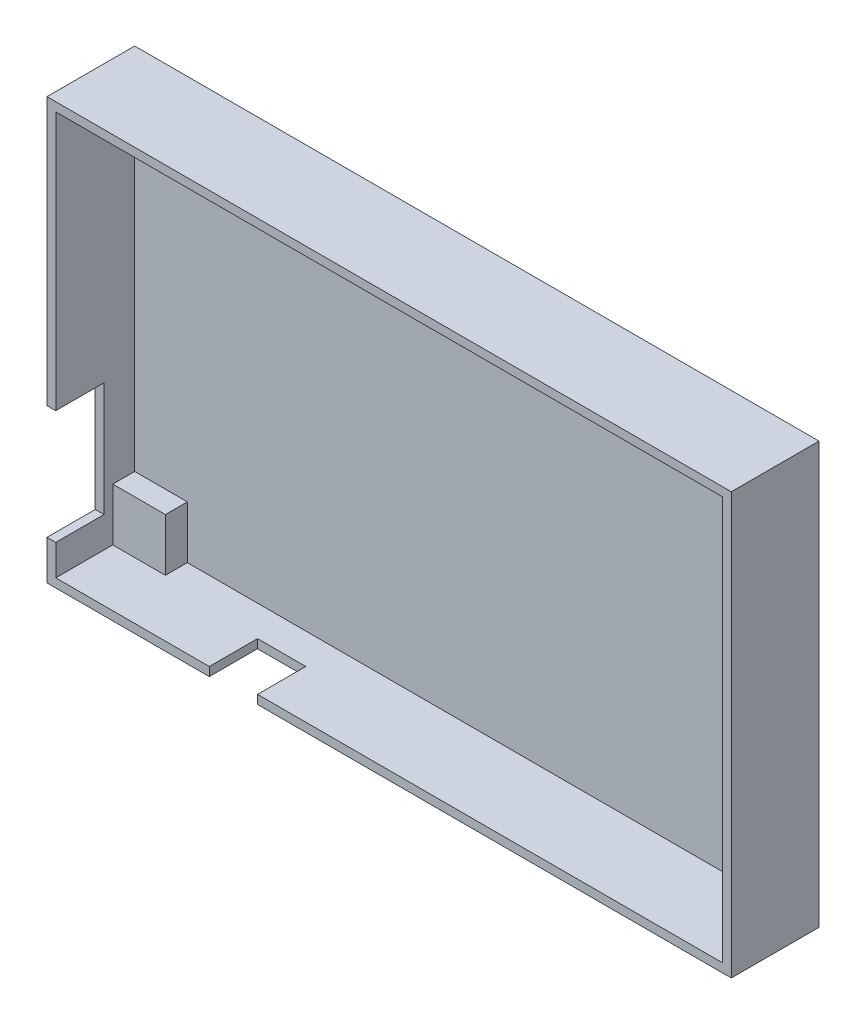
ISO-10303-21;
HEADER;
FILE_DESCRIPTION(('STEP AP214'),'2;1');
FILE_NAME('part.step','',(''),(''),'','','');
FILE_SCHEMA(('AUTOMOTIVE_DESIGN { 1 0 10303 214 1 1 1 1 }'));
ENDSEC;
DATA;
#1=APPLICATION_CONTEXT('core data for automotive mechanical design processes');
#2=APPLICATION_PROTOCOL_DEFINITION('international standard','automotive_design',2000,#1);
#3=PRODUCT_CONTEXT('',#1,'mechanical');
#4=PRODUCT('Part','Part','',(#3));
#5=PRODUCT_RELATED_PRODUCT_CATEGORY('part','',(#4));
#6=PRODUCT_DEFINITION_FORMATION('','',#4);
#7=PRODUCT_DEFINITION_CONTEXT('part definition',#1,'design');
#8=PRODUCT_DEFINITION('design','',#6,#7);
#9=PRODUCT_DEFINITION_SHAPE('','',#8);
#10=(LENGTH_UNIT() NAMED_UNIT(*) SI_UNIT(.MILLI.,.METRE.));
#11=(NAMED_UNIT(*) PLANE_ANGLE_UNIT() SI_UNIT($,.RADIAN.));
#12=(NAMED_UNIT(*) SI_UNIT($,.STERADIAN.) SOLID_ANGLE_UNIT());
#13=UNCERTAINTY_MEASURE_WITH_UNIT(LENGTH_MEASURE(1.E-05),#10,'distance_accuracy_value','');
#14=(GEOMETRIC_REPRESENTATION_CONTEXT(3) GLOBAL_UNCERTAINTY_ASSIGNED_CONTEXT((#13)) GLOBAL_UNIT_ASSIGNED_CONTEXT((#10,
#11,#12)) REPRESENTATION_CONTEXT('',''));
#15=CARTESIAN_POINT('',(0.,0.,0.));
#16=DIRECTION('',(0.,0.,1.));
#17=DIRECTION('',(1.,0.,0.));
#18=AXIS2_PLACEMENT_3D('',#15,#16,#17);
#19=CARTESIAN_POINT('',(0.,0.,20.));
#20=DIRECTION('',(0.,0.,1.));
#21=DIRECTION('',(1.,0.,0.));
#22=AXIS2_PLACEMENT_3D('',#19,#20,#21);
#23=PLANE('',#22);
#24=DIRECTION('',(1.,0.,0.));
#25=VECTOR('',#24,1.);
#26=CARTESIAN_POINT('',(-70.1385934908362,-49.4442392909897,20.));
#27=LINE('',#26,#25);
#28=CARTESIAN_POINT('',(-70.1385934908362,-49.4442392909897,20.));
#29=VERTEX_POINT('',#28);
#30=CARTESIAN_POINT('',(-33.1385934908362,-49.4442392909897,20.));
#31=VERTEX_POINT('',#30);
#32=EDGE_CURVE('E387',#29,#31,#27,.T.);
#33=ORIENTED_EDGE('',*,*,#32,.T.);
#34=DIRECTION('',(0.,-1.,0.));
#35=VECTOR('',#34,1.);
#36=CARTESIAN_POINT('',(-33.1385934908362,-43.6716541193631,20.));
#37=LINE('',#36,#35);
#38=CARTESIAN_POINT('',(-33.1385934908362,-47.4442392909897,20.));
#39=VERTEX_POINT('',#38);
#40=EDGE_CURVE('E437',#39,#31,#37,.T.);
#41=ORIENTED_EDGE('',*,*,#40,.F.);
#42=DIRECTION('',(1.,0.,0.));
#43=VECTOR('',#42,1.);
#44=CARTESIAN_POINT('',(-68.1385934908362,-47.4442392909897,20.));
#45=LINE('',#44,#43);
#46=CARTESIAN_POINT('',(-68.1385934908362,-47.4442392909897,20.));
#47=VERTEX_POINT('',#46);
#48=EDGE_CURVE('E240',#47,#39,#45,.T.);
#49=ORIENTED_EDGE('',*,*,#48,.F.);
#50=DIRECTION('',(0.,-1.,0.));
#51=VECTOR('',#50,1.);
#52=CARTESIAN_POINT('',(-68.1385934908362,44.5557607090103,20.));
#53=LINE('',#52,#51);
#54=CARTESIAN_POINT('',(-68.1385934908362,-40.4442392909897,20.));
#55=VERTEX_POINT('',#54);
#56=EDGE_CURVE('E354',#55,#47,#53,.T.);
#57=ORIENTED_EDGE('',*,*,#56,.F.);
#58=DIRECTION('',(-1.,0.,0.));
#59=VECTOR('',#58,1.);
#60=CARTESIAN_POINT('',(0.,-40.4442392909897,20.));
#61=LINE('',#60,#59);
#62=CARTESIAN_POINT('',(-70.1385934908362,-40.4442392909897,20.));
#63=VERTEX_POINT('',#62);
#64=EDGE_CURVE('E419',#55,#63,#61,.T.);
#65=ORIENTED_EDGE('',*,*,#64,.T.);
#66=DIRECTION('',(0.,-1.,0.));
#67=VECTOR('',#66,1.);
#68=CARTESIAN_POINT('',(-70.1385934908362,46.5557607090103,20.));
#69=LINE('',#68,#67);
#70=EDGE_CURVE('E382',#63,#29,#69,.T.);
#71=ORIENTED_EDGE('',*,*,#70,.T.);
#72=EDGE_LOOP('',(#33,#41,#49,#57,#65,#71));
#73=FACE_BOUND('',#72,.T.);
#74=ADVANCED_FACE('F35',(#73),#23,.T.);
#75=CARTESIAN_POINT('',(-22.1385934908362,-47.4442392909897,20.));
#76=VERTEX_POINT('',#75);
#77=CARTESIAN_POINT('',(83.8614065091638,-47.4442392909897,20.));
#78=VERTEX_POINT('',#77);
#79=EDGE_CURVE('E353',#76,#78,#45,.T.);
#80=ORIENTED_EDGE('',*,*,#79,.F.);
#81=DIRECTION('',(0.,1.,0.));
#82=VECTOR('',#81,1.);
#83=CARTESIAN_POINT('',(-22.1385934908362,-43.6716541193631,20.));
#84=LINE('',#83,#82);
#85=CARTESIAN_POINT('',(-22.1385934908362,-49.4442392909897,20.));
#86=VERTEX_POINT('',#85);
#87=EDGE_CURVE('E227',#86,#76,#84,.T.);
#88=ORIENTED_EDGE('',*,*,#87,.F.);
#89=CARTESIAN_POINT('',(85.8614065091638,-49.4442392909897,20.));
#90=VERTEX_POINT('',#89);
#91=EDGE_CURVE('E386',#86,#90,#27,.T.);
#92=ORIENTED_EDGE('',*,*,#91,.T.);
#93=DIRECTION('',(0.,1.,0.));
#94=VECTOR('',#93,1.);
#95=CARTESIAN_POINT('',(85.8614065091638,46.5557607090103,20.));
#96=LINE('',#95,#94);
#97=CARTESIAN_POINT('',(85.8614065091638,46.5557607090103,20.));
#98=VERTEX_POINT('',#97);
#99=EDGE_CURVE('E390',#90,#98,#96,.T.);
#100=ORIENTED_EDGE('',*,*,#99,.T.);
#101=DIRECTION('',(-1.,0.,0.));
#102=VECTOR('',#101,1.);
#103=CARTESIAN_POINT('',(-70.1385934908362,46.5557607090103,20.));
#104=LINE('',#103,#102);
#105=CARTESIAN_POINT('',(-70.1385934908362,46.5557607090103,20.));
#106=VERTEX_POINT('',#105);
#107=EDGE_CURVE('E393',#98,#106,#104,.T.);
#108=ORIENTED_EDGE('',*,*,#107,.T.);
#109=CARTESIAN_POINT('',(-70.1385934908362,-14.4442392909897,20.));
#110=VERTEX_POINT('',#109);
#111=EDGE_CURVE('E383',#106,#110,#69,.T.);
#112=ORIENTED_EDGE('',*,*,#111,.T.);
#113=DIRECTION('',(1.,0.,0.));
#114=VECTOR('',#113,1.);
#115=CARTESIAN_POINT('',(0.,-14.4442392909897,20.));
#116=LINE('',#115,#114);
#117=CARTESIAN_POINT('',(-68.1385934908362,-14.4442392909897,20.));
#118=VERTEX_POINT('',#117);
#119=EDGE_CURVE('E417',#110,#118,#116,.T.);
#120=ORIENTED_EDGE('',*,*,#119,.T.);
#121=CARTESIAN_POINT('',(-68.1385934908362,44.5557607090103,20.));
#122=VERTEX_POINT('',#121);
#123=EDGE_CURVE('E350',#122,#118,#53,.T.);
#124=ORIENTED_EDGE('',*,*,#123,.F.);
#125=DIRECTION('',(-1.,0.,0.));
#126=VECTOR('',#125,1.);
#127=CARTESIAN_POINT('',(-68.1385934908362,44.5557607090103,20.));
#128=LINE('',#127,#126);
#129=CARTESIAN_POINT('',(83.8614065091639,44.5557607090103,20.));
#130=VERTEX_POINT('',#129);
#131=EDGE_CURVE('E359',#130,#122,#128,.T.);
#132=ORIENTED_EDGE('',*,*,#131,.F.);
#133=DIRECTION('',(0.,1.,0.));
#134=VECTOR('',#133,1.);
#135=CARTESIAN_POINT('',(83.8614065091639,44.5557607090103,20.));
#136=LINE('',#135,#134);
#137=EDGE_CURVE('E356',#78,#130,#136,.T.);
#138=ORIENTED_EDGE('',*,*,#137,.F.);
#139=EDGE_LOOP('',(#80,#88,#92,#100,#108,#112,#120,#124,#132,#138));
#140=FACE_BOUND('',#139,.T.);
#141=ADVANCED_FACE('F434',(#140),#23,.T.);
#142=CARTESIAN_POINT('',(-68.1385934908362,-47.4442392909897,20.));
#143=DIRECTION('',(0.,1.,0.));
#144=DIRECTION('',(0.,0.,1.));
#145=AXIS2_PLACEMENT_3D('',#142,#143,#144);
#146=PLANE('',#145);
#147=ORIENTED_EDGE('',*,*,#48,.T.);
#148=DIRECTION('',(0.,0.,-1.));
#149=VECTOR('',#148,1.);
#150=CARTESIAN_POINT('',(-33.1385934908362,-47.4442392909897,20.));
#151=LINE('',#150,#149);
#152=CARTESIAN_POINT('',(-33.1385934908362,-47.4442392909897,9.));
#153=VERTEX_POINT('',#152);
#154=EDGE_CURVE('E231',#39,#153,#151,.T.);
#155=ORIENTED_EDGE('',*,*,#154,.T.);
#156=DIRECTION('',(1.,0.,0.));
#157=VECTOR('',#156,1.);
#158=CARTESIAN_POINT('',(-68.1385934908362,-47.4442392909897,9.));
#159=LINE('',#158,#157);
#160=CARTESIAN_POINT('',(-22.1385934908362,-47.4442392909897,9.));
#161=VERTEX_POINT('',#160);
#162=EDGE_CURVE('E219',#153,#161,#159,.T.);
#163=ORIENTED_EDGE('',*,*,#162,.T.);
#164=DIRECTION('',(0.,0.,1.));
#165=VECTOR('',#164,1.);
#166=CARTESIAN_POINT('',(-22.1385934908362,-47.4442392909897,20.));
#167=LINE('',#166,#165);
#168=EDGE_CURVE('E226',#161,#76,#167,.T.);
#169=ORIENTED_EDGE('',*,*,#168,.T.);
#170=ORIENTED_EDGE('',*,*,#79,.T.);
#171=DIRECTION('',(0.,0.,-1.));
#172=VECTOR('',#171,1.);
#173=CARTESIAN_POINT('',(83.8614065091638,-47.4442392909897,20.));
#174=LINE('',#173,#172);
#175=CARTESIAN_POINT('',(83.8614065091638,-47.4442392909897,7.));
#176=VERTEX_POINT('',#175);
#177=EDGE_CURVE('E376',#78,#176,#174,.T.);
#178=ORIENTED_EDGE('',*,*,#177,.T.);
#179=DIRECTION('',(1.,0.,0.));
#180=VECTOR('',#179,1.);
#181=CARTESIAN_POINT('',(83.8614065091638,-47.4442392909897,7.));
#182=LINE('',#181,#180);
#183=CARTESIAN_POINT('',(71.8614065091639,-47.4442392909897,7.));
#184=VERTEX_POINT('',#183);
#185=EDGE_CURVE('E311',#184,#176,#182,.T.);
#186=ORIENTED_EDGE('',*,*,#185,.F.);
#187=DIRECTION('',(0.,0.,-1.));
#188=VECTOR('',#187,1.);
#189=CARTESIAN_POINT('',(71.8614065091639,-47.4442392909897,7.));
#190=LINE('',#189,#188);
#191=CARTESIAN_POINT('',(71.8614065091639,-47.4442392909897,2.));
#192=VERTEX_POINT('',#191);
#193=EDGE_CURVE('E314',#184,#192,#190,.T.);
#194=ORIENTED_EDGE('',*,*,#193,.T.);
#195=DIRECTION('',(1.,0.,0.));
#196=VECTOR('',#195,1.);
#197=CARTESIAN_POINT('',(-68.1385934908362,-47.4442392909897,2.));
#198=LINE('',#197,#196);
#199=CARTESIAN_POINT('',(-56.1385934908362,-47.4442392909897,2.));
#200=VERTEX_POINT('',#199);
#201=EDGE_CURVE('E364',#200,#192,#198,.T.);
#202=ORIENTED_EDGE('',*,*,#201,.F.);
#203=DIRECTION('',(0.,0.,-1.));
#204=VECTOR('',#203,1.);
#205=CARTESIAN_POINT('',(-56.1385934908362,-47.4442392909897,7.));
#206=LINE('',#205,#204);
#207=CARTESIAN_POINT('',(-56.1385934908362,-47.4442392909897,7.));
#208=VERTEX_POINT('',#207);
#209=EDGE_CURVE('E279',#208,#200,#206,.T.);
#210=ORIENTED_EDGE('',*,*,#209,.F.);
#211=DIRECTION('',(1.,0.,0.));
#212=VECTOR('',#211,1.);
#213=CARTESIAN_POINT('',(-68.1385934908362,-47.4442392909897,7.));
#214=LINE('',#213,#212);
#215=CARTESIAN_POINT('',(-68.1385934908362,-47.4442392909897,7.));
#216=VERTEX_POINT('',#215);
#217=EDGE_CURVE('E263',#216,#208,#214,.T.);
#218=ORIENTED_EDGE('',*,*,#217,.F.);
#219=DIRECTION('',(0.,0.,-1.));
#220=VECTOR('',#219,1.);
#221=CARTESIAN_POINT('',(-68.1385934908362,-47.4442392909897,20.));
#222=LINE('',#221,#220);
#223=EDGE_CURVE('E379',#47,#216,#222,.T.);
#224=ORIENTED_EDGE('',*,*,#223,.F.);
#225=EDGE_LOOP('',(#147,#155,#163,#169,#170,#178,#186,#194,#202,#210,#218,#224));
#226=FACE_BOUND('',#225,.T.);
#227=ADVANCED_FACE('F237',(#226),#146,.T.);
#228=CARTESIAN_POINT('',(-70.1385934908361,-49.4442392909897,2.));
#229=DIRECTION('',(0.,1.,0.));
#230=DIRECTION('',(0.,0.,1.));
#231=AXIS2_PLACEMENT_3D('',#228,#229,#230);
#232=PLANE('',#231);
#233=DIRECTION('',(0.,0.,-1.));
#234=VECTOR('',#233,1.);
#235=CARTESIAN_POINT('',(-33.1385934908362,-49.4442392909897,2.));
#236=LINE('',#235,#234);
#237=CARTESIAN_POINT('',(-33.1385934908362,-49.4442392909897,9.));
#238=VERTEX_POINT('',#237);
#239=EDGE_CURVE('E11',#31,#238,#236,.T.);
#240=ORIENTED_EDGE('',*,*,#239,.F.);
#241=ORIENTED_EDGE('',*,*,#32,.F.);
#242=DIRECTION('',(0.,0.,-1.));
#243=VECTOR('',#242,1.);
#244=CARTESIAN_POINT('',(-70.1385934908361,-49.4442392909897,2.));
#245=LINE('',#244,#243);
#246=CARTESIAN_POINT('',(-70.1385934908361,-49.4442392909897,0.));
#247=VERTEX_POINT('',#246);
#248=EDGE_CURVE('E414',#29,#247,#245,.T.);
#249=ORIENTED_EDGE('',*,*,#248,.T.);
#250=DIRECTION('',(1.,0.,0.));
#251=VECTOR('',#250,1.);
#252=CARTESIAN_POINT('',(-70.1385934908361,-49.4442392909897,0.));
#253=LINE('',#252,#251);
#254=CARTESIAN_POINT('',(85.8614065091638,-49.4442392909897,0.));
#255=VERTEX_POINT('',#254);
#256=EDGE_CURVE('E399',#247,#255,#253,.T.);
#257=ORIENTED_EDGE('',*,*,#256,.T.);
#258=DIRECTION('',(0.,0.,-1.));
#259=VECTOR('',#258,1.);
#260=CARTESIAN_POINT('',(85.8614065091638,-49.4442392909897,2.));
#261=LINE('',#260,#259);
#262=EDGE_CURVE('E411',#90,#255,#261,.T.);
#263=ORIENTED_EDGE('',*,*,#262,.F.);
#264=ORIENTED_EDGE('',*,*,#91,.F.);
#265=DIRECTION('',(0.,0.,1.));
#266=VECTOR('',#265,1.);
#267=CARTESIAN_POINT('',(-22.1385934908362,-49.4442392909897,2.));
#268=LINE('',#267,#266);
#269=CARTESIAN_POINT('',(-22.1385934908362,-49.4442392909897,9.));
#270=VERTEX_POINT('',#269);
#271=EDGE_CURVE('E43',#270,#86,#268,.T.);
#272=ORIENTED_EDGE('',*,*,#271,.F.);
#273=DIRECTION('',(1.,0.,0.));
#274=VECTOR('',#273,1.);
#275=CARTESIAN_POINT('',(-70.1385934908361,-49.4442392909897,9.));
#276=LINE('',#275,#274);
#277=EDGE_CURVE('E425',#238,#270,#276,.T.);
#278=ORIENTED_EDGE('',*,*,#277,.F.);
#279=EDGE_LOOP('',(#240,#241,#249,#257,#263,#264,#272,#278));
#280=FACE_BOUND('',#279,.T.);
#281=ADVANCED_FACE('F439',(#280),#232,.F.);
#282=CARTESIAN_POINT('',(-68.1385934908362,44.5557607090103,20.));
#283=DIRECTION('',(1.,0.,0.));
#284=DIRECTION('',(0.,1.,0.));
#285=AXIS2_PLACEMENT_3D('',#282,#283,#284);
#286=PLANE('',#285);
#287=DIRECTION('',(0.,1.,0.));
#288=VECTOR('',#287,1.);
#289=CARTESIAN_POINT('',(-68.1385934908362,44.5557607090103,9.));
#290=LINE('',#289,#288);
#291=CARTESIAN_POINT('',(-68.1385934908362,-40.4442392909897,9.));
#292=VERTEX_POINT('',#291);
#293=CARTESIAN_POINT('',(-68.1385934908362,-14.4442392909897,9.));
#294=VERTEX_POINT('',#293);
#295=EDGE_CURVE('E258',#292,#294,#290,.T.);
#296=ORIENTED_EDGE('',*,*,#295,.F.);
#297=DIRECTION('',(0.,0.,1.));
#298=VECTOR('',#297,1.);
#299=CARTESIAN_POINT('',(-68.1385934908362,-40.4442392909897,20.));
#300=LINE('',#299,#298);
#301=EDGE_CURVE('E255',#292,#55,#300,.T.);
#302=ORIENTED_EDGE('',*,*,#301,.T.);
#303=ORIENTED_EDGE('',*,*,#56,.T.);
#304=ORIENTED_EDGE('',*,*,#223,.T.);
#305=DIRECTION('',(0.,-1.,0.));
#306=VECTOR('',#305,1.);
#307=CARTESIAN_POINT('',(-68.1385934908362,-47.4442392909897,7.));
#308=LINE('',#307,#306);
#309=CARTESIAN_POINT('',(-68.1385934908362,-35.4442392909897,7.));
#310=VERTEX_POINT('',#309);
#311=EDGE_CURVE('E261',#310,#216,#308,.T.);
#312=ORIENTED_EDGE('',*,*,#311,.F.);
#313=DIRECTION('',(0.,0.,-1.));
#314=VECTOR('',#313,1.);
#315=CARTESIAN_POINT('',(-68.1385934908362,-35.4442392909897,7.));
#316=LINE('',#315,#314);
#317=CARTESIAN_POINT('',(-68.1385934908362,-35.4442392909897,2.));
#318=VERTEX_POINT('',#317);
#319=EDGE_CURVE('E271',#310,#318,#316,.T.);
#320=ORIENTED_EDGE('',*,*,#319,.T.);
#321=DIRECTION('',(0.,-1.,0.));
#322=VECTOR('',#321,1.);
#323=CARTESIAN_POINT('',(-68.1385934908362,44.5557607090103,2.));
#324=LINE('',#323,#322);
#325=CARTESIAN_POINT('',(-68.1385934908362,32.5557607090103,2.));
#326=VERTEX_POINT('',#325);
#327=EDGE_CURVE('E349',#326,#318,#324,.T.);
#328=ORIENTED_EDGE('',*,*,#327,.F.);
#329=DIRECTION('',(0.,0.,-1.));
#330=VECTOR('',#329,1.);
#331=CARTESIAN_POINT('',(-68.1385934908362,32.5557607090103,7.));
#332=LINE('',#331,#330);
#333=CARTESIAN_POINT('',(-68.1385934908362,32.5557607090103,7.));
#334=VERTEX_POINT('',#333);
#335=EDGE_CURVE('E347',#334,#326,#332,.T.);
#336=ORIENTED_EDGE('',*,*,#335,.F.);
#337=DIRECTION('',(0.,-1.,0.));
#338=VECTOR('',#337,1.);
#339=CARTESIAN_POINT('',(-68.1385934908362,44.5557607090103,7.));
#340=LINE('',#339,#338);
#341=CARTESIAN_POINT('',(-68.1385934908362,44.5557607090103,7.));
#342=VERTEX_POINT('',#341);
#343=EDGE_CURVE('E328',#342,#334,#340,.T.);
#344=ORIENTED_EDGE('',*,*,#343,.F.);
#345=DIRECTION('',(0.,0.,-1.));
#346=VECTOR('',#345,1.);
#347=CARTESIAN_POINT('',(-68.1385934908362,44.5557607090103,20.));
#348=LINE('',#347,#346);
#349=EDGE_CURVE('E361',#122,#342,#348,.T.);
#350=ORIENTED_EDGE('',*,*,#349,.F.);
#351=ORIENTED_EDGE('',*,*,#123,.T.);
#352=DIRECTION('',(0.,0.,-1.));
#353=VECTOR('',#352,1.);
#354=CARTESIAN_POINT('',(-68.1385934908362,-14.4442392909897,20.));
#355=LINE('',#354,#353);
#356=EDGE_CURVE('E57',#118,#294,#355,.T.);
#357=ORIENTED_EDGE('',*,*,#356,.T.);
#358=EDGE_LOOP('',(#296,#302,#303,#304,#312,#320,#328,#336,#344,#350,#351,#357));
#359=FACE_BOUND('',#358,.T.);
#360=ADVANCED_FACE('F465',(#359),#286,.T.);
#361=CARTESIAN_POINT('',(-70.1385934908362,46.5557607090103,2.));
#362=DIRECTION('',(1.,0.,0.));
#363=DIRECTION('',(0.,1.,0.));
#364=AXIS2_PLACEMENT_3D('',#361,#362,#363);
#365=PLANE('',#364);
#366=DIRECTION('',(0.,0.,1.));
#367=VECTOR('',#366,1.);
#368=CARTESIAN_POINT('',(-70.1385934908361,-40.4442392909897,2.));
#369=LINE('',#368,#367);
#370=CARTESIAN_POINT('',(-70.1385934908361,-40.4442392909897,9.));
#371=VERTEX_POINT('',#370);
#372=EDGE_CURVE('E253',#371,#63,#369,.T.);
#373=ORIENTED_EDGE('',*,*,#372,.F.);
#374=DIRECTION('',(0.,1.,0.));
#375=VECTOR('',#374,1.);
#376=CARTESIAN_POINT('',(-70.1385934908362,46.5557607090103,9.));
#377=LINE('',#376,#375);
#378=CARTESIAN_POINT('',(-70.1385934908361,-14.4442392909897,9.));
#379=VERTEX_POINT('',#378);
#380=EDGE_CURVE('E422',#371,#379,#377,.T.);
#381=ORIENTED_EDGE('',*,*,#380,.T.);
#382=DIRECTION('',(0.,0.,-1.));
#383=VECTOR('',#382,1.);
#384=CARTESIAN_POINT('',(-70.1385934908362,-14.4442392909897,2.));
#385=LINE('',#384,#383);
#386=EDGE_CURVE('E250',#110,#379,#385,.T.);
#387=ORIENTED_EDGE('',*,*,#386,.F.);
#388=ORIENTED_EDGE('',*,*,#111,.F.);
#389=DIRECTION('',(0.,0.,-1.));
#390=VECTOR('',#389,1.);
#391=CARTESIAN_POINT('',(-70.1385934908362,46.5557607090103,2.));
#392=LINE('',#391,#390);
#393=CARTESIAN_POINT('',(-70.1385934908362,46.5557607090103,0.));
#394=VERTEX_POINT('',#393);
#395=EDGE_CURVE('E405',#106,#394,#392,.T.);
#396=ORIENTED_EDGE('',*,*,#395,.T.);
#397=DIRECTION('',(0.,-1.,0.));
#398=VECTOR('',#397,1.);
#399=CARTESIAN_POINT('',(-70.1385934908362,46.5557607090103,0.));
#400=LINE('',#399,#398);
#401=EDGE_CURVE('E396',#394,#247,#400,.T.);
#402=ORIENTED_EDGE('',*,*,#401,.T.);
#403=ORIENTED_EDGE('',*,*,#248,.F.);
#404=ORIENTED_EDGE('',*,*,#70,.F.);
#405=EDGE_LOOP('',(#373,#381,#387,#388,#396,#402,#403,#404));
#406=FACE_BOUND('',#405,.T.);
#407=ADVANCED_FACE('F37',(#406),#365,.F.);
#408=CARTESIAN_POINT('',(0.,0.,2.));
#409=DIRECTION('',(0.,0.,1.));
#410=DIRECTION('',(1.,0.,0.));
#411=AXIS2_PLACEMENT_3D('',#408,#409,#410);
#412=PLANE('',#411);
#413=DIRECTION('',(-1.,0.,0.));
#414=VECTOR('',#413,1.);
#415=CARTESIAN_POINT('',(-68.1385934908362,-35.4442392909897,2.));
#416=LINE('',#415,#414);
#417=CARTESIAN_POINT('',(-56.1385934908362,-35.4442392909897,2.));
#418=VERTEX_POINT('',#417);
#419=EDGE_CURVE('E264',#418,#318,#416,.T.);
#420=ORIENTED_EDGE('',*,*,#419,.F.);
#421=DIRECTION('',(0.,1.,0.));
#422=VECTOR('',#421,1.);
#423=CARTESIAN_POINT('',(-56.1385934908362,-47.4442392909897,2.));
#424=LINE('',#423,#422);
#425=EDGE_CURVE('E260',#200,#418,#424,.T.);
#426=ORIENTED_EDGE('',*,*,#425,.F.);
#427=ORIENTED_EDGE('',*,*,#201,.T.);
#428=DIRECTION('',(0.,-1.,0.));
#429=VECTOR('',#428,1.);
#430=CARTESIAN_POINT('',(71.8614065091639,-47.4442392909897,2.));
#431=LINE('',#430,#429);
#432=CARTESIAN_POINT('',(71.8614065091639,-35.4442392909897,2.));
#433=VERTEX_POINT('',#432);
#434=EDGE_CURVE('E306',#433,#192,#431,.T.);
#435=ORIENTED_EDGE('',*,*,#434,.F.);
#436=DIRECTION('',(-1.,0.,0.));
#437=VECTOR('',#436,1.);
#438=CARTESIAN_POINT('',(83.8614065091638,-35.4442392909897,2.));
#439=LINE('',#438,#437);
#440=CARTESIAN_POINT('',(83.8614065091638,-35.4442392909897,2.));
#441=VERTEX_POINT('',#440);
#442=EDGE_CURVE('E301',#441,#433,#439,.T.);
#443=ORIENTED_EDGE('',*,*,#442,.F.);
#444=DIRECTION('',(0.,1.,0.));
#445=VECTOR('',#444,1.);
#446=CARTESIAN_POINT('',(83.8614065091639,44.5557607090103,2.));
#447=LINE('',#446,#445);
#448=CARTESIAN_POINT('',(83.8614065091638,32.5557607090103,2.));
#449=VERTEX_POINT('',#448);
#450=EDGE_CURVE('E366',#441,#449,#447,.T.);
#451=ORIENTED_EDGE('',*,*,#450,.T.);
#452=DIRECTION('',(1.,0.,0.));
#453=VECTOR('',#452,1.);
#454=CARTESIAN_POINT('',(83.8614065091638,32.5557607090103,2.));
#455=LINE('',#454,#453);
#456=CARTESIAN_POINT('',(71.8614065091638,32.5557607090103,2.));
#457=VERTEX_POINT('',#456);
#458=EDGE_CURVE('E285',#457,#449,#455,.T.);
#459=ORIENTED_EDGE('',*,*,#458,.F.);
#460=DIRECTION('',(0.,-1.,0.));
#461=VECTOR('',#460,1.);
#462=CARTESIAN_POINT('',(71.8614065091638,44.5557607090103,2.));
#463=LINE('',#462,#461);
#464=CARTESIAN_POINT('',(71.8614065091638,44.5557607090103,2.));
#465=VERTEX_POINT('',#464);
#466=EDGE_CURVE('E281',#465,#457,#463,.T.);
#467=ORIENTED_EDGE('',*,*,#466,.F.);
#468=DIRECTION('',(-1.,0.,0.));
#469=VECTOR('',#468,1.);
#470=CARTESIAN_POINT('',(-68.1385934908362,44.5557607090103,2.));
#471=LINE('',#470,#469);
#472=CARTESIAN_POINT('',(-56.1385934908362,44.5557607090103,2.));
#473=VERTEX_POINT('',#472);
#474=EDGE_CURVE('E369',#465,#473,#471,.T.);
#475=ORIENTED_EDGE('',*,*,#474,.T.);
#476=DIRECTION('',(0.,1.,0.));
#477=VECTOR('',#476,1.);
#478=CARTESIAN_POINT('',(-56.1385934908362,44.5557607090103,2.));
#479=LINE('',#478,#477);
#480=CARTESIAN_POINT('',(-56.1385934908362,32.5557607090103,2.));
#481=VERTEX_POINT('',#480);
#482=EDGE_CURVE('E332',#481,#473,#479,.T.);
#483=ORIENTED_EDGE('',*,*,#482,.F.);
#484=DIRECTION('',(1.,0.,0.));
#485=VECTOR('',#484,1.);
#486=CARTESIAN_POINT('',(-68.1385934908362,32.5557607090103,2.));
#487=LINE('',#486,#485);
#488=EDGE_CURVE('E327',#326,#481,#487,.T.);
#489=ORIENTED_EDGE('',*,*,#488,.F.);
#490=ORIENTED_EDGE('',*,*,#327,.T.);
#491=EDGE_LOOP('',(#420,#426,#427,#435,#443,#451,#459,#467,#475,#483,#489,#490));
#492=FACE_BOUND('',#491,.T.);
#493=ADVANCED_FACE('F497',(#492),#412,.T.);
#494=CARTESIAN_POINT('',(83.8614065091639,44.5557607090103,20.));
#495=DIRECTION('',(-1.,0.,0.));
#496=DIRECTION('',(0.,-1.,0.));
#497=AXIS2_PLACEMENT_3D('',#494,#495,#496);
#498=PLANE('',#497);
#499=DIRECTION('',(0.,1.,0.));
#500=VECTOR('',#499,1.);
#501=CARTESIAN_POINT('',(83.8614065091639,44.5557607090103,7.));
#502=LINE('',#501,#500);
#503=CARTESIAN_POINT('',(83.8614065091638,32.5557607090103,7.));
#504=VERTEX_POINT('',#503);
#505=CARTESIAN_POINT('',(83.8614065091639,44.5557607090103,7.));
#506=VERTEX_POINT('',#505);
#507=EDGE_CURVE('E282',#504,#506,#502,.T.);
#508=ORIENTED_EDGE('',*,*,#507,.F.);
#509=DIRECTION('',(0.,0.,-1.));
#510=VECTOR('',#509,1.);
#511=CARTESIAN_POINT('',(83.8614065091638,32.5557607090103,7.));
#512=LINE('',#511,#510);
#513=EDGE_CURVE('E291',#504,#449,#512,.T.);
#514=ORIENTED_EDGE('',*,*,#513,.T.);
#515=ORIENTED_EDGE('',*,*,#450,.F.);
#516=DIRECTION('',(0.,0.,-1.));
#517=VECTOR('',#516,1.);
#518=CARTESIAN_POINT('',(83.8614065091638,-35.4442392909897,7.));
#519=LINE('',#518,#517);
#520=CARTESIAN_POINT('',(83.8614065091638,-35.4442392909897,7.));
#521=VERTEX_POINT('',#520);
#522=EDGE_CURVE('E324',#521,#441,#519,.T.);
#523=ORIENTED_EDGE('',*,*,#522,.F.);
#524=DIRECTION('',(0.,1.,0.));
#525=VECTOR('',#524,1.);
#526=CARTESIAN_POINT('',(83.8614065091638,-47.4442392909897,7.));
#527=LINE('',#526,#525);
#528=EDGE_CURVE('E302',#176,#521,#527,.T.);
#529=ORIENTED_EDGE('',*,*,#528,.F.);
#530=ORIENTED_EDGE('',*,*,#177,.F.);
#531=ORIENTED_EDGE('',*,*,#137,.T.);
#532=DIRECTION('',(0.,0.,-1.));
#533=VECTOR('',#532,1.);
#534=CARTESIAN_POINT('',(83.8614065091639,44.5557607090103,20.));
#535=LINE('',#534,#533);
#536=EDGE_CURVE('E373',#130,#506,#535,.T.);
#537=ORIENTED_EDGE('',*,*,#536,.T.);
#538=EDGE_LOOP('',(#508,#514,#515,#523,#529,#530,#531,#537));
#539=FACE_BOUND('',#538,.T.);
#540=ADVANCED_FACE('F482',(#539),#498,.T.);
#541=CARTESIAN_POINT('',(-68.1385934908362,44.5557607090103,20.));
#542=DIRECTION('',(0.,-1.,0.));
#543=DIRECTION('',(0.,0.,-1.));
#544=AXIS2_PLACEMENT_3D('',#541,#542,#543);
#545=PLANE('',#544);
#546=ORIENTED_EDGE('',*,*,#474,.F.);
#547=DIRECTION('',(0.,0.,-1.));
#548=VECTOR('',#547,1.);
#549=CARTESIAN_POINT('',(71.8614065091638,44.5557607090103,7.));
#550=LINE('',#549,#548);
#551=CARTESIAN_POINT('',(71.8614065091638,44.5557607090103,7.));
#552=VERTEX_POINT('',#551);
#553=EDGE_CURVE('E299',#552,#465,#550,.T.);
#554=ORIENTED_EDGE('',*,*,#553,.F.);
#555=DIRECTION('',(-1.,0.,0.));
#556=VECTOR('',#555,1.);
#557=CARTESIAN_POINT('',(83.8614065091639,44.5557607090103,7.));
#558=LINE('',#557,#556);
#559=EDGE_CURVE('E284',#506,#552,#558,.T.);
#560=ORIENTED_EDGE('',*,*,#559,.F.);
#561=ORIENTED_EDGE('',*,*,#536,.F.);
#562=ORIENTED_EDGE('',*,*,#131,.T.);
#563=ORIENTED_EDGE('',*,*,#349,.T.);
#564=DIRECTION('',(-1.,0.,0.));
#565=VECTOR('',#564,1.);
#566=CARTESIAN_POINT('',(-68.1385934908362,44.5557607090103,7.));
#567=LINE('',#566,#565);
#568=CARTESIAN_POINT('',(-56.1385934908362,44.5557607090103,7.));
#569=VERTEX_POINT('',#568);
#570=EDGE_CURVE('E336',#569,#342,#567,.T.);
#571=ORIENTED_EDGE('',*,*,#570,.F.);
#572=DIRECTION('',(0.,0.,-1.));
#573=VECTOR('',#572,1.);
#574=CARTESIAN_POINT('',(-56.1385934908362,44.5557607090103,7.));
#575=LINE('',#574,#573);
#576=EDGE_CURVE('E338',#569,#473,#575,.T.);
#577=ORIENTED_EDGE('',*,*,#576,.T.);
#578=EDGE_LOOP('',(#546,#554,#560,#561,#562,#563,#571,#577));
#579=FACE_BOUND('',#578,.T.);
#580=ADVANCED_FACE('F477',(#579),#545,.T.);
#581=CARTESIAN_POINT('',(85.8614065091638,46.5557607090103,2.));
#582=DIRECTION('',(-1.,0.,0.));
#583=DIRECTION('',(0.,-1.,0.));
#584=AXIS2_PLACEMENT_3D('',#581,#582,#583);
#585=PLANE('',#584);
#586=DIRECTION('',(0.,1.,0.));
#587=VECTOR('',#586,1.);
#588=CARTESIAN_POINT('',(85.8614065091638,46.5557607090103,0.));
#589=LINE('',#588,#587);
#590=CARTESIAN_POINT('',(85.8614065091638,46.5557607090103,0.));
#591=VERTEX_POINT('',#590);
#592=EDGE_CURVE('E401',#255,#591,#589,.T.);
#593=ORIENTED_EDGE('',*,*,#592,.T.);
#594=DIRECTION('',(0.,0.,-1.));
#595=VECTOR('',#594,1.);
#596=CARTESIAN_POINT('',(85.8614065091638,46.5557607090103,2.));
#597=LINE('',#596,#595);
#598=EDGE_CURVE('E408',#98,#591,#597,.T.);
#599=ORIENTED_EDGE('',*,*,#598,.F.);
#600=ORIENTED_EDGE('',*,*,#99,.F.);
#601=ORIENTED_EDGE('',*,*,#262,.T.);
#602=EDGE_LOOP('',(#593,#599,#600,#601));
#603=FACE_BOUND('',#602,.T.);
#604=ADVANCED_FACE('F443',(#603),#585,.F.);
#605=CARTESIAN_POINT('',(-70.1385934908362,46.5557607090103,2.));
#606=DIRECTION('',(0.,-1.,0.));
#607=DIRECTION('',(0.,0.,-1.));
#608=AXIS2_PLACEMENT_3D('',#605,#606,#607);
#609=PLANE('',#608);
#610=DIRECTION('',(-1.,0.,0.));
#611=VECTOR('',#610,1.);
#612=CARTESIAN_POINT('',(-70.1385934908362,46.5557607090103,0.));
#613=LINE('',#612,#611);
#614=EDGE_CURVE('E403',#591,#394,#613,.T.);
#615=ORIENTED_EDGE('',*,*,#614,.T.);
#616=ORIENTED_EDGE('',*,*,#395,.F.);
#617=ORIENTED_EDGE('',*,*,#107,.F.);
#618=ORIENTED_EDGE('',*,*,#598,.T.);
#619=EDGE_LOOP('',(#615,#616,#617,#618));
#620=FACE_BOUND('',#619,.T.);
#621=ADVANCED_FACE('F447',(#620),#609,.F.);
#622=CARTESIAN_POINT('',(0.,0.,0.));
#623=DIRECTION('',(0.,0.,1.));
#624=DIRECTION('',(1.,0.,0.));
#625=AXIS2_PLACEMENT_3D('',#622,#623,#624);
#626=PLANE('',#625);
#627=ORIENTED_EDGE('',*,*,#401,.F.);
#628=ORIENTED_EDGE('',*,*,#614,.F.);
#629=ORIENTED_EDGE('',*,*,#592,.F.);
#630=ORIENTED_EDGE('',*,*,#256,.F.);
#631=EDGE_LOOP('',(#627,#628,#629,#630));
#632=FACE_BOUND('',#631,.T.);
#633=ADVANCED_FACE('F455',(#632),#626,.F.);
#634=CARTESIAN_POINT('',(-68.1385934908362,32.5557607090103,7.));
#635=DIRECTION('',(0.,1.,0.));
#636=DIRECTION('',(0.,0.,1.));
#637=AXIS2_PLACEMENT_3D('',#634,#635,#636);
#638=PLANE('',#637);
#639=ORIENTED_EDGE('',*,*,#488,.T.);
#640=DIRECTION('',(0.,0.,-1.));
#641=VECTOR('',#640,1.);
#642=CARTESIAN_POINT('',(-56.1385934908362,32.5557607090103,7.));
#643=LINE('',#642,#641);
#644=CARTESIAN_POINT('',(-56.1385934908362,32.5557607090103,7.));
#645=VERTEX_POINT('',#644);
#646=EDGE_CURVE('E345',#645,#481,#643,.T.);
#647=ORIENTED_EDGE('',*,*,#646,.F.);
#648=DIRECTION('',(1.,0.,0.));
#649=VECTOR('',#648,1.);
#650=CARTESIAN_POINT('',(-68.1385934908362,32.5557607090103,7.));
#651=LINE('',#650,#649);
#652=EDGE_CURVE('E331',#334,#645,#651,.T.);
#653=ORIENTED_EDGE('',*,*,#652,.F.);
#654=ORIENTED_EDGE('',*,*,#335,.T.);
#655=EDGE_LOOP('',(#639,#647,#653,#654));
#656=FACE_BOUND('',#655,.T.);
#657=ADVANCED_FACE('F515',(#656),#638,.F.);
#658=CARTESIAN_POINT('',(-56.1385934908362,44.5557607090103,7.));
#659=DIRECTION('',(-1.,0.,0.));
#660=DIRECTION('',(0.,0.,1.));
#661=AXIS2_PLACEMENT_3D('',#658,#659,#660);
#662=PLANE('',#661);
#663=ORIENTED_EDGE('',*,*,#482,.T.);
#664=ORIENTED_EDGE('',*,*,#576,.F.);
#665=DIRECTION('',(0.,1.,0.));
#666=VECTOR('',#665,1.);
#667=CARTESIAN_POINT('',(-56.1385934908362,44.5557607090103,7.));
#668=LINE('',#667,#666);
#669=EDGE_CURVE('E334',#645,#569,#668,.T.);
#670=ORIENTED_EDGE('',*,*,#669,.F.);
#671=ORIENTED_EDGE('',*,*,#646,.T.);
#672=EDGE_LOOP('',(#663,#664,#670,#671));
#673=FACE_BOUND('',#672,.T.);
#674=ADVANCED_FACE('F521',(#673),#662,.F.);
#675=CARTESIAN_POINT('',(0.,0.,7.));
#676=DIRECTION('',(0.,0.,1.));
#677=DIRECTION('',(1.,0.,0.));
#678=AXIS2_PLACEMENT_3D('',#675,#676,#677);
#679=PLANE('',#678);
#680=ORIENTED_EDGE('',*,*,#343,.T.);
#681=ORIENTED_EDGE('',*,*,#652,.T.);
#682=ORIENTED_EDGE('',*,*,#669,.T.);
#683=ORIENTED_EDGE('',*,*,#570,.T.);
#684=EDGE_LOOP('',(#680,#681,#682,#683));
#685=FACE_BOUND('',#684,.T.);
#686=ADVANCED_FACE('F518',(#685),#679,.T.);
#687=CARTESIAN_POINT('',(83.8614065091638,-35.4442392909897,7.));
#688=DIRECTION('',(0.,-1.,0.));
#689=DIRECTION('',(0.,0.,-1.));
#690=AXIS2_PLACEMENT_3D('',#687,#688,#689);
#691=PLANE('',#690);
#692=ORIENTED_EDGE('',*,*,#442,.T.);
#693=DIRECTION('',(0.,0.,-1.));
#694=VECTOR('',#693,1.);
#695=CARTESIAN_POINT('',(71.8614065091639,-35.4442392909897,7.));
#696=LINE('',#695,#694);
#697=CARTESIAN_POINT('',(71.8614065091639,-35.4442392909897,7.));
#698=VERTEX_POINT('',#697);
#699=EDGE_CURVE('E321',#698,#433,#696,.T.);
#700=ORIENTED_EDGE('',*,*,#699,.F.);
#701=DIRECTION('',(-1.,0.,0.));
#702=VECTOR('',#701,1.);
#703=CARTESIAN_POINT('',(83.8614065091638,-35.4442392909897,7.));
#704=LINE('',#703,#702);
#705=EDGE_CURVE('E305',#521,#698,#704,.T.);
#706=ORIENTED_EDGE('',*,*,#705,.F.);
#707=ORIENTED_EDGE('',*,*,#522,.T.);
#708=EDGE_LOOP('',(#692,#700,#706,#707));
#709=FACE_BOUND('',#708,.T.);
#710=ADVANCED_FACE('F537',(#709),#691,.F.);
#711=CARTESIAN_POINT('',(71.8614065091639,-47.4442392909897,7.));
#712=DIRECTION('',(1.,0.,0.));
#713=DIRECTION('',(0.,0.,-1.));
#714=AXIS2_PLACEMENT_3D('',#711,#712,#713);
#715=PLANE('',#714);
#716=ORIENTED_EDGE('',*,*,#434,.T.);
#717=ORIENTED_EDGE('',*,*,#193,.F.);
#718=DIRECTION('',(0.,-1.,0.));
#719=VECTOR('',#718,1.);
#720=CARTESIAN_POINT('',(71.8614065091639,-47.4442392909897,7.));
#721=LINE('',#720,#719);
#722=EDGE_CURVE('E308',#698,#184,#721,.T.);
#723=ORIENTED_EDGE('',*,*,#722,.F.);
#724=ORIENTED_EDGE('',*,*,#699,.T.);
#725=EDGE_LOOP('',(#716,#717,#723,#724));
#726=FACE_BOUND('',#725,.T.);
#727=ADVANCED_FACE('F490',(#726),#715,.F.);
#728=CARTESIAN_POINT('',(0.,0.,7.));
#729=DIRECTION('',(0.,0.,1.));
#730=DIRECTION('',(1.,0.,0.));
#731=AXIS2_PLACEMENT_3D('',#728,#729,#730);
#732=PLANE('',#731);
#733=ORIENTED_EDGE('',*,*,#528,.T.);
#734=ORIENTED_EDGE('',*,*,#705,.T.);
#735=ORIENTED_EDGE('',*,*,#722,.T.);
#736=ORIENTED_EDGE('',*,*,#185,.T.);
#737=EDGE_LOOP('',(#733,#734,#735,#736));
#738=FACE_BOUND('',#737,.T.);
#739=ADVANCED_FACE('F484',(#738),#732,.T.);
#740=CARTESIAN_POINT('',(71.8614065091638,44.5557607090103,7.));
#741=DIRECTION('',(1.,0.,0.));
#742=DIRECTION('',(0.,0.,-1.));
#743=AXIS2_PLACEMENT_3D('',#740,#741,#742);
#744=PLANE('',#743);
#745=ORIENTED_EDGE('',*,*,#466,.T.);
#746=DIRECTION('',(0.,0.,-1.));
#747=VECTOR('',#746,1.);
#748=CARTESIAN_POINT('',(71.8614065091638,32.5557607090103,7.));
#749=LINE('',#748,#747);
#750=CARTESIAN_POINT('',(71.8614065091638,32.5557607090103,7.));
#751=VERTEX_POINT('',#750);
#752=EDGE_CURVE('E296',#751,#457,#749,.T.);
#753=ORIENTED_EDGE('',*,*,#752,.F.);
#754=DIRECTION('',(0.,-1.,0.));
#755=VECTOR('',#754,1.);
#756=CARTESIAN_POINT('',(71.8614065091638,44.5557607090103,7.));
#757=LINE('',#756,#755);
#758=EDGE_CURVE('E287',#552,#751,#757,.T.);
#759=ORIENTED_EDGE('',*,*,#758,.F.);
#760=ORIENTED_EDGE('',*,*,#553,.T.);
#761=EDGE_LOOP('',(#745,#753,#759,#760));
#762=FACE_BOUND('',#761,.T.);
#763=ADVANCED_FACE('F527',(#762),#744,.F.);
#764=CARTESIAN_POINT('',(83.8614065091638,32.5557607090103,7.));
#765=DIRECTION('',(0.,1.,0.));
#766=DIRECTION('',(0.,0.,1.));
#767=AXIS2_PLACEMENT_3D('',#764,#765,#766);
#768=PLANE('',#767);
#769=ORIENTED_EDGE('',*,*,#458,.T.);
#770=ORIENTED_EDGE('',*,*,#513,.F.);
#771=DIRECTION('',(1.,0.,0.));
#772=VECTOR('',#771,1.);
#773=CARTESIAN_POINT('',(83.8614065091638,32.5557607090103,7.));
#774=LINE('',#773,#772);
#775=EDGE_CURVE('E289',#751,#504,#774,.T.);
#776=ORIENTED_EDGE('',*,*,#775,.F.);
#777=ORIENTED_EDGE('',*,*,#752,.T.);
#778=EDGE_LOOP('',(#769,#770,#776,#777));
#779=FACE_BOUND('',#778,.T.);
#780=ADVANCED_FACE('F531',(#779),#768,.F.);
#781=CARTESIAN_POINT('',(0.,0.,7.));
#782=DIRECTION('',(0.,0.,-1.));
#783=DIRECTION('',(-1.,0.,0.));
#784=AXIS2_PLACEMENT_3D('',#781,#782,#783);
#785=PLANE('',#784);
#786=ORIENTED_EDGE('',*,*,#507,.T.);
#787=ORIENTED_EDGE('',*,*,#559,.T.);
#788=ORIENTED_EDGE('',*,*,#758,.T.);
#789=ORIENTED_EDGE('',*,*,#775,.T.);
#790=EDGE_LOOP('',(#786,#787,#788,#789));
#791=FACE_BOUND('',#790,.T.);
#792=ADVANCED_FACE('F534',(#791),#785,.F.);
#793=CARTESIAN_POINT('',(-56.1385934908362,-47.4442392909897,7.));
#794=DIRECTION('',(-1.,0.,0.));
#795=DIRECTION('',(0.,0.,1.));
#796=AXIS2_PLACEMENT_3D('',#793,#794,#795);
#797=PLANE('',#796);
#798=ORIENTED_EDGE('',*,*,#425,.T.);
#799=DIRECTION('',(0.,0.,-1.));
#800=VECTOR('',#799,1.);
#801=CARTESIAN_POINT('',(-56.1385934908362,-35.4442392909897,7.));
#802=LINE('',#801,#800);
#803=CARTESIAN_POINT('',(-56.1385934908362,-35.4442392909897,7.));
#804=VERTEX_POINT('',#803);
#805=EDGE_CURVE('E276',#804,#418,#802,.T.);
#806=ORIENTED_EDGE('',*,*,#805,.F.);
#807=DIRECTION('',(0.,1.,0.));
#808=VECTOR('',#807,1.);
#809=CARTESIAN_POINT('',(-56.1385934908362,-47.4442392909897,7.));
#810=LINE('',#809,#808);
#811=EDGE_CURVE('E266',#208,#804,#810,.T.);
#812=ORIENTED_EDGE('',*,*,#811,.F.);
#813=ORIENTED_EDGE('',*,*,#209,.T.);
#814=EDGE_LOOP('',(#798,#806,#812,#813));
#815=FACE_BOUND('',#814,.T.);
#816=ADVANCED_FACE('F500',(#815),#797,.F.);
#817=CARTESIAN_POINT('',(-68.1385934908362,-35.4442392909897,7.));
#818=DIRECTION('',(0.,-1.,0.));
#819=DIRECTION('',(0.,0.,-1.));
#820=AXIS2_PLACEMENT_3D('',#817,#818,#819);
#821=PLANE('',#820);
#822=ORIENTED_EDGE('',*,*,#419,.T.);
#823=ORIENTED_EDGE('',*,*,#319,.F.);
#824=DIRECTION('',(-1.,0.,0.));
#825=VECTOR('',#824,1.);
#826=CARTESIAN_POINT('',(-68.1385934908362,-35.4442392909897,7.));
#827=LINE('',#826,#825);
#828=EDGE_CURVE('E268',#804,#310,#827,.T.);
#829=ORIENTED_EDGE('',*,*,#828,.F.);
#830=ORIENTED_EDGE('',*,*,#805,.T.);
#831=EDGE_LOOP('',(#822,#823,#829,#830));
#832=FACE_BOUND('',#831,.T.);
#833=ADVANCED_FACE('F504',(#832),#821,.F.);
#834=CARTESIAN_POINT('',(0.,0.,7.));
#835=DIRECTION('',(0.,0.,-1.));
#836=DIRECTION('',(-1.,0.,0.));
#837=AXIS2_PLACEMENT_3D('',#834,#835,#836);
#838=PLANE('',#837);
#839=ORIENTED_EDGE('',*,*,#311,.T.);
#840=ORIENTED_EDGE('',*,*,#217,.T.);
#841=ORIENTED_EDGE('',*,*,#811,.T.);
#842=ORIENTED_EDGE('',*,*,#828,.T.);
#843=EDGE_LOOP('',(#839,#840,#841,#842));
#844=FACE_BOUND('',#843,.T.);
#845=ADVANCED_FACE('F507',(#844),#838,.F.);
#846=CARTESIAN_POINT('',(0.,0.,9.));
#847=DIRECTION('',(0.,0.,-1.));
#848=DIRECTION('',(-1.,0.,0.));
#849=AXIS2_PLACEMENT_3D('',#846,#847,#848);
#850=PLANE('',#849);
#851=ORIENTED_EDGE('',*,*,#295,.T.);
#852=DIRECTION('',(-1.,0.,0.));
#853=VECTOR('',#852,1.);
#854=CARTESIAN_POINT('',(-74.9000932296533,-14.4442392909897,9.));
#855=LINE('',#854,#853);
#856=EDGE_CURVE('E244',#294,#379,#855,.T.);
#857=ORIENTED_EDGE('',*,*,#856,.T.);
#858=ORIENTED_EDGE('',*,*,#380,.F.);
#859=DIRECTION('',(1.,0.,0.));
#860=VECTOR('',#859,1.);
#861=CARTESIAN_POINT('',(-74.9000932296533,-40.4442392909897,9.));
#862=LINE('',#861,#860);
#863=EDGE_CURVE('E241',#371,#292,#862,.T.);
#864=ORIENTED_EDGE('',*,*,#863,.T.);
#865=EDGE_LOOP('',(#851,#857,#858,#864));
#866=FACE_BOUND('',#865,.T.);
#867=ADVANCED_FACE('F467',(#866),#850,.F.);
#868=CARTESIAN_POINT('',(-74.9000932296533,-40.4442392909897,20.));
#869=DIRECTION('',(0.,1.,0.));
#870=DIRECTION('',(0.,0.,1.));
#871=AXIS2_PLACEMENT_3D('',#868,#869,#870);
#872=PLANE('',#871);
#873=ORIENTED_EDGE('',*,*,#863,.F.);
#874=ORIENTED_EDGE('',*,*,#372,.T.);
#875=ORIENTED_EDGE('',*,*,#64,.F.);
#876=ORIENTED_EDGE('',*,*,#301,.F.);
#877=EDGE_LOOP('',(#873,#874,#875,#876));
#878=FACE_BOUND('',#877,.T.);
#879=ADVANCED_FACE('F462',(#878),#872,.T.);
#880=CARTESIAN_POINT('',(-74.9000932296533,-14.4442392909897,20.));
#881=DIRECTION('',(0.,-1.,0.));
#882=DIRECTION('',(0.,0.,-1.));
#883=AXIS2_PLACEMENT_3D('',#880,#881,#882);
#884=PLANE('',#883);
#885=ORIENTED_EDGE('',*,*,#119,.F.);
#886=ORIENTED_EDGE('',*,*,#386,.T.);
#887=ORIENTED_EDGE('',*,*,#856,.F.);
#888=ORIENTED_EDGE('',*,*,#356,.F.);
#889=EDGE_LOOP('',(#885,#886,#887,#888));
#890=FACE_BOUND('',#889,.T.);
#891=ADVANCED_FACE('F468',(#890),#884,.T.);
#892=CARTESIAN_POINT('',(-33.1385934908362,-43.6716541193631,20.));
#893=DIRECTION('',(1.,0.,0.));
#894=DIRECTION('',(0.,0.,-1.));
#895=AXIS2_PLACEMENT_3D('',#892,#893,#894);
#896=PLANE('',#895);
#897=ORIENTED_EDGE('',*,*,#40,.T.);
#898=ORIENTED_EDGE('',*,*,#239,.T.);
#899=DIRECTION('',(0.,-1.,0.));
#900=VECTOR('',#899,1.);
#901=CARTESIAN_POINT('',(-33.1385934908362,-43.6716541193631,9.));
#902=LINE('',#901,#900);
#903=EDGE_CURVE('E50',#153,#238,#902,.T.);
#904=ORIENTED_EDGE('',*,*,#903,.F.);
#905=ORIENTED_EDGE('',*,*,#154,.F.);
#906=EDGE_LOOP('',(#897,#898,#904,#905));
#907=FACE_BOUND('',#906,.T.);
#908=ADVANCED_FACE('F230',(#907),#896,.T.);
#909=CARTESIAN_POINT('',(-22.1385934908362,-43.6716541193631,20.));
#910=DIRECTION('',(-1.,0.,0.));
#911=DIRECTION('',(0.,0.,1.));
#912=AXIS2_PLACEMENT_3D('',#909,#910,#911);
#913=PLANE('',#912);
#914=DIRECTION('',(0.,1.,0.));
#915=VECTOR('',#914,1.);
#916=CARTESIAN_POINT('',(-22.1385934908362,-43.6716541193631,9.));
#917=LINE('',#916,#915);
#918=EDGE_CURVE('E222',#270,#161,#917,.T.);
#919=ORIENTED_EDGE('',*,*,#918,.F.);
#920=ORIENTED_EDGE('',*,*,#271,.T.);
#921=ORIENTED_EDGE('',*,*,#87,.T.);
#922=ORIENTED_EDGE('',*,*,#168,.F.);
#923=EDGE_LOOP('',(#919,#920,#921,#922));
#924=FACE_BOUND('',#923,.T.);
#925=ADVANCED_FACE('F429',(#924),#913,.T.);
#926=CARTESIAN_POINT('',(0.,0.,9.));
#927=DIRECTION('',(0.,0.,1.));
#928=DIRECTION('',(1.,0.,0.));
#929=AXIS2_PLACEMENT_3D('',#926,#927,#928);
#930=PLANE('',#929);
#931=ORIENTED_EDGE('',*,*,#903,.T.);
#932=ORIENTED_EDGE('',*,*,#277,.T.);
#933=ORIENTED_EDGE('',*,*,#918,.T.);
#934=ORIENTED_EDGE('',*,*,#162,.F.);
#935=EDGE_LOOP('',(#931,#932,#933,#934));
#936=FACE_BOUND('',#935,.T.);
#937=ADVANCED_FACE('F220',(#936),#930,.T.);
#938=CLOSED_SHELL('',(#74,#141,#227,#281,#360,#407,#493,#540,#580,#604,#621,#633,#657,#674,#686,
#710,#727,#739,#763,#780,#792,#816,#833,#845,#867,#879,#891,#908,#925,#937));
#939=MANIFOLD_SOLID_BREP('B2',#938);
#940=ADVANCED_BREP_SHAPE_REPRESENTATION('',(#18,#939),#14);
#941=SHAPE_DEFINITION_REPRESENTATION(#9,#940);
ENDSEC;
END-ISO-10303-21;
